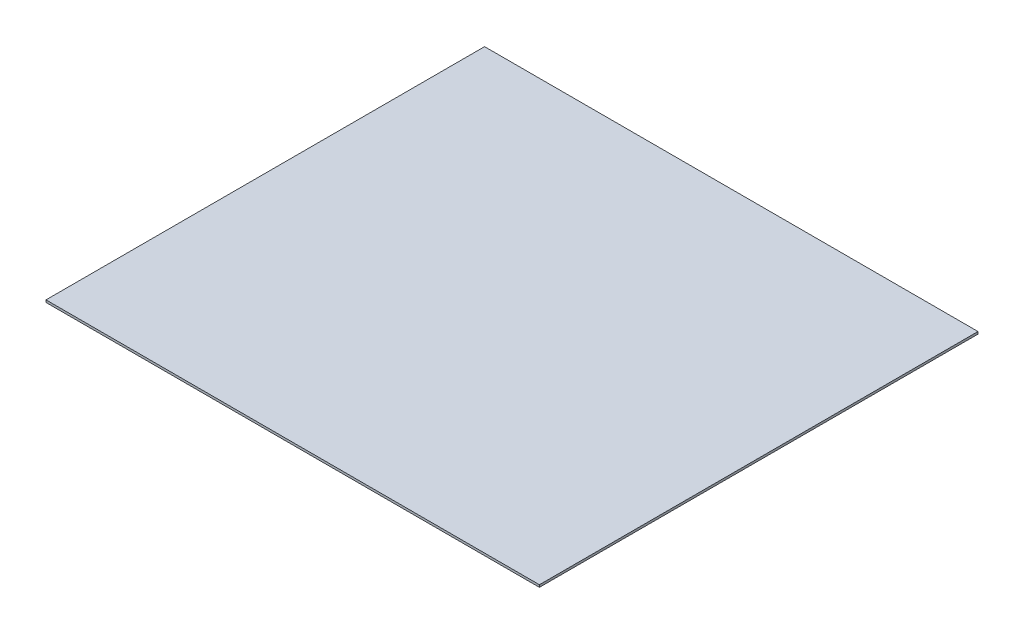
ISO-10303-21;
HEADER;
FILE_DESCRIPTION(('STEP AP214'),'2;1');
FILE_NAME('part.step','',(''),(''),'','','');
FILE_SCHEMA(('AUTOMOTIVE_DESIGN { 1 0 10303 214 1 1 1 1 }'));
ENDSEC;
DATA;
#1=APPLICATION_CONTEXT('core data for automotive mechanical design processes');
#2=APPLICATION_PROTOCOL_DEFINITION('international standard','automotive_design',2000,#1);
#3=PRODUCT_CONTEXT('',#1,'mechanical');
#4=PRODUCT('Part','Part','',(#3));
#5=PRODUCT_RELATED_PRODUCT_CATEGORY('part','',(#4));
#6=PRODUCT_DEFINITION_FORMATION('','',#4);
#7=PRODUCT_DEFINITION_CONTEXT('part definition',#1,'design');
#8=PRODUCT_DEFINITION('design','',#6,#7);
#9=PRODUCT_DEFINITION_SHAPE('','',#8);
#10=(LENGTH_UNIT() NAMED_UNIT(*) SI_UNIT(.MILLI.,.METRE.));
#11=(NAMED_UNIT(*) PLANE_ANGLE_UNIT() SI_UNIT($,.RADIAN.));
#12=(NAMED_UNIT(*) SI_UNIT($,.STERADIAN.) SOLID_ANGLE_UNIT());
#13=UNCERTAINTY_MEASURE_WITH_UNIT(LENGTH_MEASURE(1.E-05),#10,'distance_accuracy_value','');
#14=(GEOMETRIC_REPRESENTATION_CONTEXT(3) GLOBAL_UNCERTAINTY_ASSIGNED_CONTEXT((#13)) GLOBAL_UNIT_ASSIGNED_CONTEXT((#10,
#11,#12)) REPRESENTATION_CONTEXT('',''));
#15=CARTESIAN_POINT('',(0.,0.,0.));
#16=DIRECTION('',(0.,0.,1.));
#17=DIRECTION('',(1.,0.,0.));
#18=AXIS2_PLACEMENT_3D('',#15,#16,#17);
#19=CARTESIAN_POINT('',(-342.9,3.175,292.653440366972));
#20=DIRECTION('',(-1.,0.,0.));
#21=DIRECTION('',(0.,0.,1.));
#22=AXIS2_PLACEMENT_3D('',#19,#20,#21);
#23=PLANE('',#22);
#24=DIRECTION('',(0.,0.,-1.));
#25=VECTOR('',#24,1.);
#26=CARTESIAN_POINT('',(-342.9,0.,292.653440366972));
#27=LINE('',#26,#25);
#28=CARTESIAN_POINT('',(-342.9,0.,292.653440366972));
#29=VERTEX_POINT('',#28);
#30=CARTESIAN_POINT('',(-342.9,0.,-316.946559633028));
#31=VERTEX_POINT('',#30);
#32=EDGE_CURVE('E117',#29,#31,#27,.T.);
#33=ORIENTED_EDGE('',*,*,#32,.F.);
#34=DIRECTION('',(0.,-1.,0.));
#35=VECTOR('',#34,1.);
#36=CARTESIAN_POINT('',(-342.9,3.175,292.653440366972));
#37=LINE('',#36,#35);
#38=CARTESIAN_POINT('',(-342.9,3.175,292.653440366972));
#39=VERTEX_POINT('',#38);
#40=EDGE_CURVE('E11',#39,#29,#37,.T.);
#41=ORIENTED_EDGE('',*,*,#40,.F.);
#42=DIRECTION('',(0.,0.,-1.));
#43=VECTOR('',#42,1.);
#44=CARTESIAN_POINT('',(-342.9,3.175,292.653440366972));
#45=LINE('',#44,#43);
#46=CARTESIAN_POINT('',(-342.9,3.175,-316.946559633028));
#47=VERTEX_POINT('',#46);
#48=EDGE_CURVE('E109',#39,#47,#45,.T.);
#49=ORIENTED_EDGE('',*,*,#48,.T.);
#50=DIRECTION('',(0.,-1.,0.));
#51=VECTOR('',#50,1.);
#52=CARTESIAN_POINT('',(-342.9,3.175,-316.946559633028));
#53=LINE('',#52,#51);
#54=EDGE_CURVE('E43',#47,#31,#53,.T.);
#55=ORIENTED_EDGE('',*,*,#54,.T.);
#56=EDGE_LOOP('',(#33,#41,#49,#55));
#57=FACE_BOUND('',#56,.T.);
#58=ADVANCED_FACE('F40',(#57),#23,.T.);
#59=CARTESIAN_POINT('',(-342.9,3.175,292.653440366972));
#60=DIRECTION('',(0.,0.,-1.));
#61=DIRECTION('',(-1.,0.,0.));
#62=AXIS2_PLACEMENT_3D('',#59,#60,#61);
#63=PLANE('',#62);
#64=DIRECTION('',(1.,0.,0.));
#65=VECTOR('',#64,1.);
#66=CARTESIAN_POINT('',(-342.9,0.,292.653440366972));
#67=LINE('',#66,#65);
#68=CARTESIAN_POINT('',(342.9,0.,292.653440366972));
#69=VERTEX_POINT('',#68);
#70=EDGE_CURVE('E79',#29,#69,#67,.T.);
#71=ORIENTED_EDGE('',*,*,#70,.T.);
#72=DIRECTION('',(0.,-1.,0.));
#73=VECTOR('',#72,1.);
#74=CARTESIAN_POINT('',(342.9,3.175,292.653440366972));
#75=LINE('',#74,#73);
#76=CARTESIAN_POINT('',(342.9,3.175,292.653440366972));
#77=VERTEX_POINT('',#76);
#78=EDGE_CURVE('E50',#77,#69,#75,.T.);
#79=ORIENTED_EDGE('',*,*,#78,.F.);
#80=DIRECTION('',(1.,0.,0.));
#81=VECTOR('',#80,1.);
#82=CARTESIAN_POINT('',(-342.9,3.175,292.653440366972));
#83=LINE('',#82,#81);
#84=EDGE_CURVE('E97',#39,#77,#83,.T.);
#85=ORIENTED_EDGE('',*,*,#84,.F.);
#86=ORIENTED_EDGE('',*,*,#40,.T.);
#87=EDGE_LOOP('',(#71,#79,#85,#86));
#88=FACE_BOUND('',#87,.T.);
#89=ADVANCED_FACE('F132',(#88),#63,.F.);
#90=CARTESIAN_POINT('',(342.9,3.175,292.653440366972));
#91=DIRECTION('',(-1.,0.,0.));
#92=DIRECTION('',(0.,0.,1.));
#93=AXIS2_PLACEMENT_3D('',#90,#91,#92);
#94=PLANE('',#93);
#95=DIRECTION('',(0.,0.,-1.));
#96=VECTOR('',#95,1.);
#97=CARTESIAN_POINT('',(342.9,0.,292.653440366972));
#98=LINE('',#97,#96);
#99=CARTESIAN_POINT('',(342.9,0.,-316.946559633028));
#100=VERTEX_POINT('',#99);
#101=EDGE_CURVE('E105',#69,#100,#98,.T.);
#102=ORIENTED_EDGE('',*,*,#101,.T.);
#103=DIRECTION('',(0.,-1.,0.));
#104=VECTOR('',#103,1.);
#105=CARTESIAN_POINT('',(342.9,3.175,-316.946559633028));
#106=LINE('',#105,#104);
#107=CARTESIAN_POINT('',(342.9,3.175,-316.946559633028));
#108=VERTEX_POINT('',#107);
#109=EDGE_CURVE('E102',#108,#100,#106,.T.);
#110=ORIENTED_EDGE('',*,*,#109,.F.);
#111=DIRECTION('',(0.,0.,-1.));
#112=VECTOR('',#111,1.);
#113=CARTESIAN_POINT('',(342.9,3.175,292.653440366972));
#114=LINE('',#113,#112);
#115=EDGE_CURVE('E92',#77,#108,#114,.T.);
#116=ORIENTED_EDGE('',*,*,#115,.F.);
#117=ORIENTED_EDGE('',*,*,#78,.T.);
#118=EDGE_LOOP('',(#102,#110,#116,#117));
#119=FACE_BOUND('',#118,.T.);
#120=ADVANCED_FACE('F103',(#119),#94,.F.);
#121=CARTESIAN_POINT('',(-342.9,3.175,-316.946559633028));
#122=DIRECTION('',(0.,0.,-1.));
#123=DIRECTION('',(-1.,0.,0.));
#124=AXIS2_PLACEMENT_3D('',#121,#122,#123);
#125=PLANE('',#124);
#126=DIRECTION('',(1.,0.,0.));
#127=VECTOR('',#126,1.);
#128=CARTESIAN_POINT('',(-342.9,0.,-316.946559633028));
#129=LINE('',#128,#127);
#130=EDGE_CURVE('E121',#31,#100,#129,.T.);
#131=ORIENTED_EDGE('',*,*,#130,.F.);
#132=ORIENTED_EDGE('',*,*,#54,.F.);
#133=DIRECTION('',(1.,0.,0.));
#134=VECTOR('',#133,1.);
#135=CARTESIAN_POINT('',(-342.9,3.175,-316.946559633028));
#136=LINE('',#135,#134);
#137=EDGE_CURVE('E96',#47,#108,#136,.T.);
#138=ORIENTED_EDGE('',*,*,#137,.T.);
#139=ORIENTED_EDGE('',*,*,#109,.T.);
#140=EDGE_LOOP('',(#131,#132,#138,#139));
#141=FACE_BOUND('',#140,.T.);
#142=ADVANCED_FACE('F107',(#141),#125,.T.);
#143=CARTESIAN_POINT('',(0.,3.175,0.));
#144=DIRECTION('',(0.,-1.,0.));
#145=DIRECTION('',(0.,0.,-1.));
#146=AXIS2_PLACEMENT_3D('',#143,#144,#145);
#147=PLANE('',#146);
#148=ORIENTED_EDGE('',*,*,#48,.F.);
#149=ORIENTED_EDGE('',*,*,#84,.T.);
#150=ORIENTED_EDGE('',*,*,#115,.T.);
#151=ORIENTED_EDGE('',*,*,#137,.F.);
#152=EDGE_LOOP('',(#148,#149,#150,#151));
#153=FACE_BOUND('',#152,.T.);
#154=ADVANCED_FACE('F95',(#153),#147,.F.);
#155=CARTESIAN_POINT('',(0.,0.,0.));
#156=DIRECTION('',(0.,-1.,0.));
#157=DIRECTION('',(0.,0.,-1.));
#158=AXIS2_PLACEMENT_3D('',#155,#156,#157);
#159=PLANE('',#158);
#160=ORIENTED_EDGE('',*,*,#32,.T.);
#161=ORIENTED_EDGE('',*,*,#130,.T.);
#162=ORIENTED_EDGE('',*,*,#101,.F.);
#163=ORIENTED_EDGE('',*,*,#70,.F.);
#164=EDGE_LOOP('',(#160,#161,#162,#163));
#165=FACE_BOUND('',#164,.T.);
#166=ADVANCED_FACE('F130',(#165),#159,.T.);
#167=CLOSED_SHELL('',(#58,#89,#120,#142,#154,#166));
#168=MANIFOLD_SOLID_BREP('B2',#167);
#169=ADVANCED_BREP_SHAPE_REPRESENTATION('',(#18,#168),#14);
#170=SHAPE_DEFINITION_REPRESENTATION(#9,#169);
ENDSEC;
END-ISO-10303-21;
